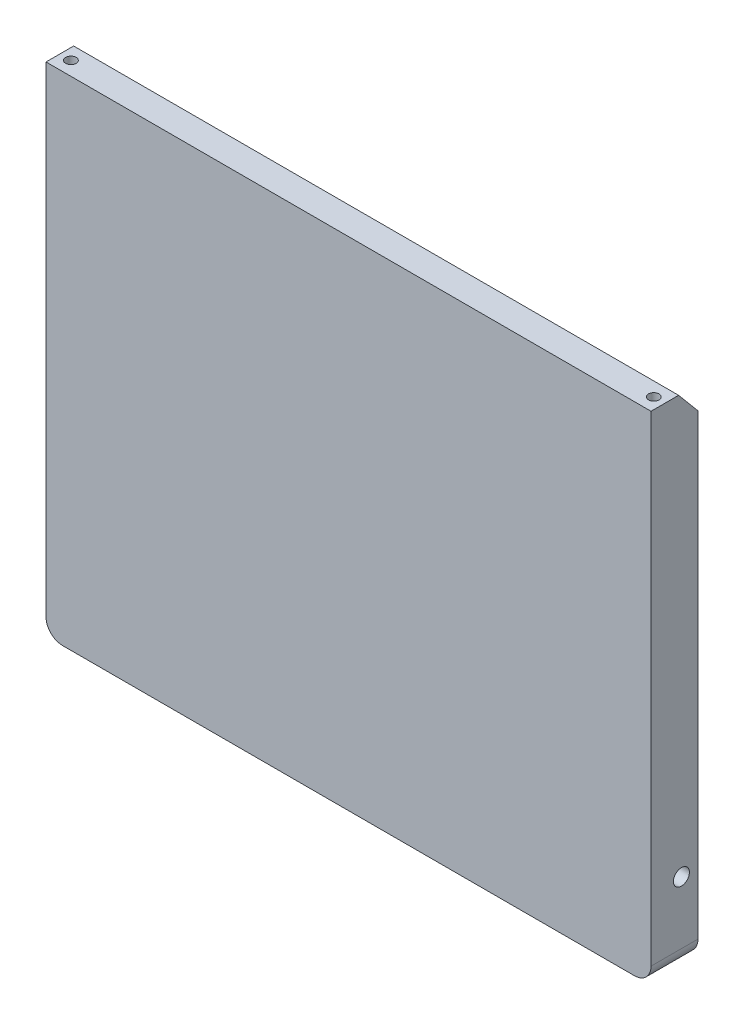
ISO-10303-21;
HEADER;
FILE_DESCRIPTION(('STEP AP214'),'2;1');
FILE_NAME('part.step','',(''),(''),'','','');
FILE_SCHEMA(('AUTOMOTIVE_DESIGN { 1 0 10303 214 1 1 1 1 }'));
ENDSEC;
DATA;
#1=APPLICATION_CONTEXT('core data for automotive mechanical design processes');
#2=APPLICATION_PROTOCOL_DEFINITION('international standard','automotive_design',2000,#1);
#3=PRODUCT_CONTEXT('',#1,'mechanical');
#4=PRODUCT('Part','Part','',(#3));
#5=PRODUCT_RELATED_PRODUCT_CATEGORY('part','',(#4));
#6=PRODUCT_DEFINITION_FORMATION('','',#4);
#7=PRODUCT_DEFINITION_CONTEXT('part definition',#1,'design');
#8=PRODUCT_DEFINITION('design','',#6,#7);
#9=PRODUCT_DEFINITION_SHAPE('','',#8);
#10=(LENGTH_UNIT() NAMED_UNIT(*) SI_UNIT(.MILLI.,.METRE.));
#11=(NAMED_UNIT(*) PLANE_ANGLE_UNIT() SI_UNIT($,.RADIAN.));
#12=(NAMED_UNIT(*) SI_UNIT($,.STERADIAN.) SOLID_ANGLE_UNIT());
#13=UNCERTAINTY_MEASURE_WITH_UNIT(LENGTH_MEASURE(1.E-05),#10,'distance_accuracy_value','');
#14=(GEOMETRIC_REPRESENTATION_CONTEXT(3) GLOBAL_UNCERTAINTY_ASSIGNED_CONTEXT((#13)) GLOBAL_UNIT_ASSIGNED_CONTEXT((#10,
#11,#12)) REPRESENTATION_CONTEXT('',''));
#15=CARTESIAN_POINT('',(0.,0.,0.));
#16=DIRECTION('',(0.,0.,1.));
#17=DIRECTION('',(1.,0.,0.));
#18=AXIS2_PLACEMENT_3D('',#15,#16,#17);
#19=CARTESIAN_POINT('',(-5.30656779661017,-80.8019491525424,5.));
#20=DIRECTION('',(1.,0.,0.));
#21=DIRECTION('',(0.,0.,-1.));
#22=AXIS2_PLACEMENT_3D('',#19,#20,#21);
#23=PLANE('',#22);
#24=CARTESIAN_POINT('',(-5.30656779661018,-66.5519491525424,-0.500000000000002));
#25=DIRECTION('',(1.,0.,0.));
#26=DIRECTION('',(0.,0.,-1.));
#27=AXIS2_PLACEMENT_3D('',#24,#25,#26);
#28=CIRCLE('',#27,1.44999999999999);
#29=CARTESIAN_POINT('',(-5.30656779661018,-66.5519491525424,-1.94999999999999));
#30=VERTEX_POINT('',#29);
#31=EDGE_CURVE('E567',#30,#30,#28,.T.);
#32=ORIENTED_EDGE('',*,*,#31,.T.);
#33=EDGE_LOOP('',(#32));
#34=FACE_BOUND('',#33,.T.);
#35=DIRECTION('',(0.,0.,-1.));
#36=VECTOR('',#35,1.);
#37=CARTESIAN_POINT('',(-5.30656779661017,9.19805084745762,5.));
#38=LINE('',#37,#36);
#39=CARTESIAN_POINT('',(-5.30656779661017,9.19805084745762,5.));
#40=VERTEX_POINT('',#39);
#41=CARTESIAN_POINT('',(-5.30656779661017,9.19805084745762,0.));
#42=VERTEX_POINT('',#41);
#43=EDGE_CURVE('E203',#40,#42,#38,.T.);
#44=ORIENTED_EDGE('',*,*,#43,.T.);
#45=DIRECTION('',(0.,-0.766044443118977,-0.642787609686541));
#46=VECTOR('',#45,1.);
#47=CARTESIAN_POINT('',(-5.30656779661016,5.02691327337787,-3.5));
#48=LINE('',#47,#46);
#49=CARTESIAN_POINT('',(-5.30656779661017,5.02691327337787,-3.5));
#50=VERTEX_POINT('',#49);
#51=EDGE_CURVE('E11',#42,#50,#48,.T.);
#52=ORIENTED_EDGE('',*,*,#51,.T.);
#53=DIRECTION('',(0.,1.,0.));
#54=VECTOR('',#53,1.);
#55=CARTESIAN_POINT('',(-5.30656779661017,-77.8019491525424,-3.5));
#56=LINE('',#55,#54);
#57=CARTESIAN_POINT('',(-5.30656779661017,-77.8019491525424,-3.5));
#58=VERTEX_POINT('',#57);
#59=EDGE_CURVE('E178',#58,#50,#56,.T.);
#60=ORIENTED_EDGE('',*,*,#59,.F.);
#61=DIRECTION('',(0.,0.,-1.));
#62=VECTOR('',#61,1.);
#63=CARTESIAN_POINT('',(-5.30656779661017,-77.8019491525424,5.));
#64=LINE('',#63,#62);
#65=CARTESIAN_POINT('',(-5.30656779661017,-77.8019491525424,5.));
#66=VERTEX_POINT('',#65);
#67=EDGE_CURVE('E218',#58,#66,#64,.F.);
#68=ORIENTED_EDGE('',*,*,#67,.T.);
#69=DIRECTION('',(0.,-1.,0.));
#70=VECTOR('',#69,1.);
#71=CARTESIAN_POINT('',(-5.30656779661017,-80.8019491525424,5.));
#72=LINE('',#71,#70);
#73=EDGE_CURVE('E185',#40,#66,#72,.T.);
#74=ORIENTED_EDGE('',*,*,#73,.F.);
#75=EDGE_LOOP('',(#44,#52,#60,#68,#74));
#76=FACE_BOUND('',#75,.T.);
#77=ADVANCED_FACE('F41',(#34,#76),#23,.F.);
#78=CARTESIAN_POINT('',(-5.30656779661017,-80.8019491525424,5.));
#79=DIRECTION('',(0.,1.,0.));
#80=DIRECTION('',(0.,0.,1.));
#81=AXIS2_PLACEMENT_3D('',#78,#79,#80);
#82=PLANE('',#81);
#83=DIRECTION('',(0.,0.,-1.));
#84=VECTOR('',#83,1.);
#85=CARTESIAN_POINT('',(-2.30656779661017,-80.8019491525424,5.));
#86=LINE('',#85,#84);
#87=CARTESIAN_POINT('',(-2.30656779661017,-80.8019491525424,5.));
#88=VERTEX_POINT('',#87);
#89=CARTESIAN_POINT('',(-2.30656779661017,-80.8019491525424,-3.5));
#90=VERTEX_POINT('',#89);
#91=EDGE_CURVE('E210',#88,#90,#86,.T.);
#92=ORIENTED_EDGE('',*,*,#91,.T.);
#93=DIRECTION('',(-1.,0.,0.));
#94=VECTOR('',#93,1.);
#95=CARTESIAN_POINT('',(101.21343220339,-80.8019491525424,-3.5));
#96=LINE('',#95,#94);
#97=CARTESIAN_POINT('',(101.21343220339,-80.8019491525424,-3.5));
#98=VERTEX_POINT('',#97);
#99=EDGE_CURVE('E172',#98,#90,#96,.T.);
#100=ORIENTED_EDGE('',*,*,#99,.F.);
#101=DIRECTION('',(0.,0.,-1.));
#102=VECTOR('',#101,1.);
#103=CARTESIAN_POINT('',(101.21343220339,-80.8019491525424,5.));
#104=LINE('',#103,#102);
#105=CARTESIAN_POINT('',(101.21343220339,-80.8019491525424,5.));
#106=VERTEX_POINT('',#105);
#107=EDGE_CURVE('E212',#98,#106,#104,.F.);
#108=ORIENTED_EDGE('',*,*,#107,.T.);
#109=DIRECTION('',(1.,0.,0.));
#110=VECTOR('',#109,1.);
#111=CARTESIAN_POINT('',(-5.30656779661017,-80.8019491525424,5.));
#112=LINE('',#111,#110);
#113=EDGE_CURVE('E196',#88,#106,#112,.T.);
#114=ORIENTED_EDGE('',*,*,#113,.F.);
#115=EDGE_LOOP('',(#92,#100,#108,#114));
#116=FACE_BOUND('',#115,.T.);
#117=ADVANCED_FACE('F254',(#116),#82,.F.);
#118=CARTESIAN_POINT('',(104.21343220339,-80.8019491525424,5.));
#119=DIRECTION('',(-1.,0.,0.));
#120=DIRECTION('',(0.,0.,1.));
#121=AXIS2_PLACEMENT_3D('',#118,#119,#120);
#122=PLANE('',#121);
#123=CARTESIAN_POINT('',(104.21343220339,-66.5519491525424,-0.500000000000002));
#124=DIRECTION('',(1.,0.,0.));
#125=DIRECTION('',(0.,0.,-1.));
#126=AXIS2_PLACEMENT_3D('',#123,#124,#125);
#127=CIRCLE('',#126,1.44999999999999);
#128=CARTESIAN_POINT('',(104.21343220339,-66.5519491525424,-1.94999999999999));
#129=VERTEX_POINT('',#128);
#130=EDGE_CURVE('E151',#129,#129,#127,.T.);
#131=ORIENTED_EDGE('',*,*,#130,.F.);
#132=EDGE_LOOP('',(#131));
#133=FACE_BOUND('',#132,.T.);
#134=DIRECTION('',(0.,-1.,0.));
#135=VECTOR('',#134,1.);
#136=CARTESIAN_POINT('',(104.21343220339,9.19805084745762,-3.5));
#137=LINE('',#136,#135);
#138=CARTESIAN_POINT('',(104.21343220339,5.02691327337787,-3.5));
#139=VERTEX_POINT('',#138);
#140=CARTESIAN_POINT('',(104.21343220339,-77.8019491525424,-3.5));
#141=VERTEX_POINT('',#140);
#142=EDGE_CURVE('E164',#139,#141,#137,.T.);
#143=ORIENTED_EDGE('',*,*,#142,.F.);
#144=DIRECTION('',(0.,0.766044443118977,0.642787609686541));
#145=VECTOR('',#144,1.);
#146=CARTESIAN_POINT('',(104.21343220339,5.02691327337787,-3.5));
#147=LINE('',#146,#145);
#148=CARTESIAN_POINT('',(104.21343220339,9.19805084745762,0.));
#149=VERTEX_POINT('',#148);
#150=EDGE_CURVE('E223',#139,#149,#147,.T.);
#151=ORIENTED_EDGE('',*,*,#150,.T.);
#152=DIRECTION('',(0.,0.,-1.));
#153=VECTOR('',#152,1.);
#154=CARTESIAN_POINT('',(104.21343220339,9.19805084745762,5.));
#155=LINE('',#154,#153);
#156=CARTESIAN_POINT('',(104.21343220339,9.19805084745762,5.));
#157=VERTEX_POINT('',#156);
#158=EDGE_CURVE('E205',#157,#149,#155,.T.);
#159=ORIENTED_EDGE('',*,*,#158,.F.);
#160=DIRECTION('',(0.,1.,0.));
#161=VECTOR('',#160,1.);
#162=CARTESIAN_POINT('',(104.21343220339,-80.8019491525424,5.));
#163=LINE('',#162,#161);
#164=CARTESIAN_POINT('',(104.21343220339,-77.8019491525424,5.));
#165=VERTEX_POINT('',#164);
#166=EDGE_CURVE('E199',#165,#157,#163,.T.);
#167=ORIENTED_EDGE('',*,*,#166,.F.);
#168=DIRECTION('',(0.,0.,-1.));
#169=VECTOR('',#168,1.);
#170=CARTESIAN_POINT('',(104.21343220339,-77.8019491525424,5.));
#171=LINE('',#170,#169);
#172=EDGE_CURVE('E207',#165,#141,#171,.T.);
#173=ORIENTED_EDGE('',*,*,#172,.T.);
#174=EDGE_LOOP('',(#143,#151,#159,#167,#173));
#175=FACE_BOUND('',#174,.T.);
#176=ADVANCED_FACE('F227',(#133,#175),#122,.F.);
#177=CARTESIAN_POINT('',(-5.30656779661017,9.19805084745762,5.));
#178=DIRECTION('',(0.,-1.,0.));
#179=DIRECTION('',(0.,0.,-1.));
#180=AXIS2_PLACEMENT_3D('',#177,#178,#179);
#181=PLANE('',#180);
#182=CARTESIAN_POINT('',(102.21343220339,9.19805084745762,2.5));
#183=DIRECTION('',(0.,1.,0.));
#184=DIRECTION('',(0.,0.,1.));
#185=AXIS2_PLACEMENT_3D('',#182,#183,#184);
#186=CIRCLE('',#185,0.950000000000002);
#187=CARTESIAN_POINT('',(102.21343220339,9.19805084745762,3.45));
#188=VERTEX_POINT('',#187);
#189=EDGE_CURVE('E186',#188,#188,#186,.T.);
#190=ORIENTED_EDGE('',*,*,#189,.F.);
#191=EDGE_LOOP('',(#190));
#192=FACE_BOUND('',#191,.T.);
#193=CARTESIAN_POINT('',(-3.30656779661017,9.19805084745762,2.5));
#194=DIRECTION('',(0.,1.,0.));
#195=DIRECTION('',(0.,0.,1.));
#196=AXIS2_PLACEMENT_3D('',#193,#194,#195);
#197=CIRCLE('',#196,0.95);
#198=CARTESIAN_POINT('',(-3.30656779661017,9.19805084745762,3.45));
#199=VERTEX_POINT('',#198);
#200=EDGE_CURVE('E189',#199,#199,#197,.T.);
#201=ORIENTED_EDGE('',*,*,#200,.F.);
#202=EDGE_LOOP('',(#201));
#203=FACE_BOUND('',#202,.T.);
#204=ORIENTED_EDGE('',*,*,#158,.T.);
#205=DIRECTION('',(-1.,0.,0.));
#206=VECTOR('',#205,1.);
#207=CARTESIAN_POINT('',(-5.30656779661017,9.19805084745762,0.));
#208=LINE('',#207,#206);
#209=EDGE_CURVE('E50',#149,#42,#208,.T.);
#210=ORIENTED_EDGE('',*,*,#209,.T.);
#211=ORIENTED_EDGE('',*,*,#43,.F.);
#212=DIRECTION('',(-1.,0.,0.));
#213=VECTOR('',#212,1.);
#214=CARTESIAN_POINT('',(-5.30656779661017,9.19805084745762,5.));
#215=LINE('',#214,#213);
#216=EDGE_CURVE('E201',#157,#40,#215,.T.);
#217=ORIENTED_EDGE('',*,*,#216,.F.);
#218=EDGE_LOOP('',(#204,#210,#211,#217));
#219=FACE_BOUND('',#218,.T.);
#220=ADVANCED_FACE('F232',(#192,#203,#219),#181,.F.);
#221=CARTESIAN_POINT('',(0.,0.,5.));
#222=DIRECTION('',(0.,0.,-1.));
#223=DIRECTION('',(-1.,0.,0.));
#224=AXIS2_PLACEMENT_3D('',#221,#222,#223);
#225=PLANE('',#224);
#226=ORIENTED_EDGE('',*,*,#113,.T.);
#227=CARTESIAN_POINT('',(101.21343220339,-77.8019491525424,5.));
#228=DIRECTION('',(0.,0.,-1.));
#229=DIRECTION('',(-1.,0.,0.));
#230=AXIS2_PLACEMENT_3D('',#227,#228,#229);
#231=CIRCLE('',#230,3.);
#232=EDGE_CURVE('E216',#106,#165,#231,.F.);
#233=ORIENTED_EDGE('',*,*,#232,.T.);
#234=ORIENTED_EDGE('',*,*,#166,.T.);
#235=ORIENTED_EDGE('',*,*,#216,.T.);
#236=ORIENTED_EDGE('',*,*,#73,.T.);
#237=CARTESIAN_POINT('',(-2.30656779661017,-77.8019491525424,5.));
#238=DIRECTION('',(0.,0.,-1.));
#239=DIRECTION('',(-1.,0.,0.));
#240=AXIS2_PLACEMENT_3D('',#237,#238,#239);
#241=CIRCLE('',#240,3.);
#242=EDGE_CURVE('E214',#66,#88,#241,.F.);
#243=ORIENTED_EDGE('',*,*,#242,.T.);
#244=EDGE_LOOP('',(#226,#233,#234,#235,#236,#243));
#245=FACE_BOUND('',#244,.T.);
#246=ADVANCED_FACE('F246',(#245),#225,.F.);
#247=CARTESIAN_POINT('',(-3.30656779661017,2.19805084745762,2.5));
#248=DIRECTION('',(0.,1.,0.));
#249=DIRECTION('',(0.,0.,1.));
#250=AXIS2_PLACEMENT_3D('',#247,#248,#249);
#251=CYLINDRICAL_SURFACE('',#250,0.95);
#252=CARTESIAN_POINT('',(-3.30656779661017,2.19805084745762,2.5));
#253=DIRECTION('',(0.,1.,0.));
#254=DIRECTION('',(0.,0.,1.));
#255=AXIS2_PLACEMENT_3D('',#252,#253,#254);
#256=CIRCLE('',#255,0.95);
#257=CARTESIAN_POINT('',(-3.30656779661017,2.19805084745762,3.45));
#258=VERTEX_POINT('',#257);
#259=EDGE_CURVE('E181',#258,#258,#256,.T.);
#260=ORIENTED_EDGE('',*,*,#259,.F.);
#261=EDGE_LOOP('',(#260));
#262=FACE_BOUND('',#261,.T.);
#263=ORIENTED_EDGE('',*,*,#200,.T.);
#264=EDGE_LOOP('',(#263));
#265=FACE_BOUND('',#264,.T.);
#266=ADVANCED_FACE('F289',(#262,#265),#251,.F.);
#267=CARTESIAN_POINT('',(-3.30656779661017,2.19805084745762,2.5));
#268=DIRECTION('',(0.,1.,0.));
#269=DIRECTION('',(0.,0.,1.));
#270=AXIS2_PLACEMENT_3D('',#267,#268,#269);
#271=PLANE('',#270);
#272=ORIENTED_EDGE('',*,*,#259,.T.);
#273=EDGE_LOOP('',(#272));
#274=FACE_BOUND('',#273,.T.);
#275=ADVANCED_FACE('F287',(#274),#271,.T.);
#276=CARTESIAN_POINT('',(102.21343220339,2.19805084745762,2.5));
#277=DIRECTION('',(0.,1.,0.));
#278=DIRECTION('',(0.,0.,1.));
#279=AXIS2_PLACEMENT_3D('',#276,#277,#278);
#280=CYLINDRICAL_SURFACE('',#279,0.950000000000002);
#281=CARTESIAN_POINT('',(102.21343220339,2.19805084745762,2.5));
#282=DIRECTION('',(0.,1.,0.));
#283=DIRECTION('',(0.,0.,1.));
#284=AXIS2_PLACEMENT_3D('',#281,#282,#283);
#285=CIRCLE('',#284,0.950000000000002);
#286=CARTESIAN_POINT('',(102.21343220339,2.19805084745762,3.45));
#287=VERTEX_POINT('',#286);
#288=EDGE_CURVE('E182',#287,#287,#285,.T.);
#289=ORIENTED_EDGE('',*,*,#288,.F.);
#290=EDGE_LOOP('',(#289));
#291=FACE_BOUND('',#290,.T.);
#292=ORIENTED_EDGE('',*,*,#189,.T.);
#293=EDGE_LOOP('',(#292));
#294=FACE_BOUND('',#293,.T.);
#295=ADVANCED_FACE('F283',(#291,#294),#280,.F.);
#296=CARTESIAN_POINT('',(102.21343220339,2.19805084745762,2.5));
#297=DIRECTION('',(0.,1.,0.));
#298=DIRECTION('',(0.,0.,1.));
#299=AXIS2_PLACEMENT_3D('',#296,#297,#298);
#300=PLANE('',#299);
#301=ORIENTED_EDGE('',*,*,#288,.T.);
#302=EDGE_LOOP('',(#301));
#303=FACE_BOUND('',#302,.T.);
#304=ADVANCED_FACE('F268',(#303),#300,.T.);
#305=CARTESIAN_POINT('',(101.21343220339,-77.8019491525424,5.));
#306=DIRECTION('',(0.,0.,-1.));
#307=DIRECTION('',(-1.,0.,0.));
#308=AXIS2_PLACEMENT_3D('',#305,#306,#307);
#309=CYLINDRICAL_SURFACE('',#308,3.);
#310=ORIENTED_EDGE('',*,*,#232,.F.);
#311=ORIENTED_EDGE('',*,*,#107,.F.);
#312=CARTESIAN_POINT('',(101.21343220339,-77.8019491525424,-3.5));
#313=DIRECTION('',(0.,0.,-1.));
#314=DIRECTION('',(-1.,0.,0.));
#315=AXIS2_PLACEMENT_3D('',#312,#313,#314);
#316=CIRCLE('',#315,3.);
#317=EDGE_CURVE('E169',#141,#98,#316,.T.);
#318=ORIENTED_EDGE('',*,*,#317,.F.);
#319=ORIENTED_EDGE('',*,*,#172,.F.);
#320=EDGE_LOOP('',(#310,#311,#318,#319));
#321=FACE_BOUND('',#320,.T.);
#322=ADVANCED_FACE('F252',(#321),#309,.T.);
#323=CARTESIAN_POINT('',(-2.30656779661017,-77.8019491525424,5.));
#324=DIRECTION('',(0.,0.,-1.));
#325=DIRECTION('',(-1.,0.,0.));
#326=AXIS2_PLACEMENT_3D('',#323,#324,#325);
#327=CYLINDRICAL_SURFACE('',#326,3.);
#328=ORIENTED_EDGE('',*,*,#242,.F.);
#329=ORIENTED_EDGE('',*,*,#67,.F.);
#330=CARTESIAN_POINT('',(-2.30656779661017,-77.8019491525424,-3.5));
#331=DIRECTION('',(0.,0.,-1.));
#332=DIRECTION('',(-1.,0.,0.));
#333=AXIS2_PLACEMENT_3D('',#330,#331,#332);
#334=CIRCLE('',#333,3.);
#335=EDGE_CURVE('E175',#90,#58,#334,.T.);
#336=ORIENTED_EDGE('',*,*,#335,.F.);
#337=ORIENTED_EDGE('',*,*,#91,.F.);
#338=EDGE_LOOP('',(#328,#329,#336,#337));
#339=FACE_BOUND('',#338,.T.);
#340=ADVANCED_FACE('F244',(#339),#327,.T.);
#341=CARTESIAN_POINT('',(101.21343220339,-77.8019491525424,-3.5));
#342=DIRECTION('',(0.,0.,-1.));
#343=DIRECTION('',(-1.,0.,0.));
#344=AXIS2_PLACEMENT_3D('',#341,#342,#343);
#345=PLANE('',#344);
#346=DIRECTION('',(0.,-1.,0.));
#347=VECTOR('',#346,1.);
#348=CARTESIAN_POINT('',(99.5534322033898,3.79805084745763,-3.5));
#349=LINE('',#348,#347);
#350=CARTESIAN_POINT('',(99.5534322033898,3.79805084745763,-3.5));
#351=VERTEX_POINT('',#350);
#352=CARTESIAN_POINT('',(99.5534322033898,-75.4019491525424,-3.5));
#353=VERTEX_POINT('',#352);
#354=EDGE_CURVE('E57',#351,#353,#349,.T.);
#355=ORIENTED_EDGE('',*,*,#354,.F.);
#356=DIRECTION('',(1.,0.,0.));
#357=VECTOR('',#356,1.);
#358=CARTESIAN_POINT('',(99.5534322033898,3.79805084745763,-3.5));
#359=LINE('',#358,#357);
#360=CARTESIAN_POINT('',(-0.646567796610172,3.79805084745764,-3.5));
#361=VERTEX_POINT('',#360);
#362=EDGE_CURVE('E145',#361,#351,#359,.T.);
#363=ORIENTED_EDGE('',*,*,#362,.F.);
#364=DIRECTION('',(0.,1.,0.));
#365=VECTOR('',#364,1.);
#366=CARTESIAN_POINT('',(-0.646567796610172,3.79805084745764,-3.5));
#367=LINE('',#366,#365);
#368=CARTESIAN_POINT('',(-0.646567796610172,-75.4019491525424,-3.5));
#369=VERTEX_POINT('',#368);
#370=EDGE_CURVE('E148',#369,#361,#367,.T.);
#371=ORIENTED_EDGE('',*,*,#370,.F.);
#372=DIRECTION('',(-1.,0.,0.));
#373=VECTOR('',#372,1.);
#374=CARTESIAN_POINT('',(99.5534322033898,-75.4019491525424,-3.5));
#375=LINE('',#374,#373);
#376=EDGE_CURVE('E157',#353,#369,#375,.T.);
#377=ORIENTED_EDGE('',*,*,#376,.F.);
#378=EDGE_LOOP('',(#355,#363,#371,#377));
#379=FACE_BOUND('',#378,.T.);
#380=ORIENTED_EDGE('',*,*,#59,.T.);
#381=DIRECTION('',(1.,0.,0.));
#382=VECTOR('',#381,1.);
#383=CARTESIAN_POINT('',(104.21343220339,5.02691327337787,-3.5));
#384=LINE('',#383,#382);
#385=EDGE_CURVE('E220',#50,#139,#384,.T.);
#386=ORIENTED_EDGE('',*,*,#385,.T.);
#387=ORIENTED_EDGE('',*,*,#142,.T.);
#388=ORIENTED_EDGE('',*,*,#317,.T.);
#389=ORIENTED_EDGE('',*,*,#99,.T.);
#390=ORIENTED_EDGE('',*,*,#335,.T.);
#391=EDGE_LOOP('',(#380,#386,#387,#388,#389,#390));
#392=FACE_BOUND('',#391,.T.);
#393=ADVANCED_FACE('F238',(#379,#392),#345,.T.);
#394=CARTESIAN_POINT('',(101.21343220339,5.02691327337787,-3.5));
#395=DIRECTION('',(0.,0.642787609686541,-0.766044443118977));
#396=DIRECTION('',(-1.,0.,0.));
#397=AXIS2_PLACEMENT_3D('',#394,#395,#396);
#398=PLANE('',#397);
#399=ORIENTED_EDGE('',*,*,#51,.F.);
#400=ORIENTED_EDGE('',*,*,#209,.F.);
#401=ORIENTED_EDGE('',*,*,#150,.F.);
#402=ORIENTED_EDGE('',*,*,#385,.F.);
#403=EDGE_LOOP('',(#399,#400,#401,#402));
#404=FACE_BOUND('',#403,.T.);
#405=ADVANCED_FACE('F44',(#404),#398,.T.);
#406=CARTESIAN_POINT('',(99.5534322033898,3.79805084745763,3.));
#407=DIRECTION('',(1.,0.,0.));
#408=DIRECTION('',(0.,0.,-1.));
#409=AXIS2_PLACEMENT_3D('',#406,#407,#408);
#410=PLANE('',#409);
#411=ORIENTED_EDGE('',*,*,#354,.T.);
#412=DIRECTION('',(0.,0.,-1.));
#413=VECTOR('',#412,1.);
#414=CARTESIAN_POINT('',(99.5534322033898,-75.4019491525424,3.));
#415=LINE('',#414,#413);
#416=CARTESIAN_POINT('',(99.5534322033898,-75.4019491525424,3.));
#417=VERTEX_POINT('',#416);
#418=EDGE_CURVE('E123',#417,#353,#415,.T.);
#419=ORIENTED_EDGE('',*,*,#418,.F.);
#420=DIRECTION('',(0.,-1.,0.));
#421=VECTOR('',#420,1.);
#422=CARTESIAN_POINT('',(99.5534322033898,3.79805084745763,3.));
#423=LINE('',#422,#421);
#424=CARTESIAN_POINT('',(99.5534322033898,3.79805084745763,3.));
#425=VERTEX_POINT('',#424);
#426=EDGE_CURVE('E127',#425,#417,#423,.T.);
#427=ORIENTED_EDGE('',*,*,#426,.F.);
#428=DIRECTION('',(0.,0.,-1.));
#429=VECTOR('',#428,1.);
#430=CARTESIAN_POINT('',(99.5534322033898,3.79805084745763,3.));
#431=LINE('',#430,#429);
#432=EDGE_CURVE('E162',#425,#351,#431,.T.);
#433=ORIENTED_EDGE('',*,*,#432,.T.);
#434=EDGE_LOOP('',(#411,#419,#427,#433));
#435=FACE_BOUND('',#434,.T.);
#436=ADVANCED_FACE('F125',(#435),#410,.F.);
#437=CARTESIAN_POINT('',(99.5534322033898,3.79805084745763,3.));
#438=DIRECTION('',(0.,1.,0.));
#439=DIRECTION('',(-1.,0.,0.));
#440=AXIS2_PLACEMENT_3D('',#437,#438,#439);
#441=PLANE('',#440);
#442=ORIENTED_EDGE('',*,*,#362,.T.);
#443=ORIENTED_EDGE('',*,*,#432,.F.);
#444=DIRECTION('',(1.,0.,0.));
#445=VECTOR('',#444,1.);
#446=CARTESIAN_POINT('',(99.5534322033898,3.79805084745763,3.));
#447=LINE('',#446,#445);
#448=CARTESIAN_POINT('',(-0.646567796610172,3.79805084745764,3.));
#449=VERTEX_POINT('',#448);
#450=EDGE_CURVE('E133',#449,#425,#447,.T.);
#451=ORIENTED_EDGE('',*,*,#450,.F.);
#452=DIRECTION('',(0.,0.,-1.));
#453=VECTOR('',#452,1.);
#454=CARTESIAN_POINT('',(-0.646567796610172,3.79805084745764,3.));
#455=LINE('',#454,#453);
#456=EDGE_CURVE('E165',#449,#361,#455,.T.);
#457=ORIENTED_EDGE('',*,*,#456,.T.);
#458=EDGE_LOOP('',(#442,#443,#451,#457));
#459=FACE_BOUND('',#458,.T.);
#460=ADVANCED_FACE('F356',(#459),#441,.F.);
#461=CARTESIAN_POINT('',(-0.646567796610172,3.79805084745764,3.));
#462=DIRECTION('',(-1.,0.,0.));
#463=DIRECTION('',(0.,0.,1.));
#464=AXIS2_PLACEMENT_3D('',#461,#462,#463);
#465=PLANE('',#464);
#466=ORIENTED_EDGE('',*,*,#370,.T.);
#467=ORIENTED_EDGE('',*,*,#456,.F.);
#468=DIRECTION('',(0.,1.,0.));
#469=VECTOR('',#468,1.);
#470=CARTESIAN_POINT('',(-0.646567796610172,3.79805084745764,3.));
#471=LINE('',#470,#469);
#472=CARTESIAN_POINT('',(-0.646567796610172,-75.4019491525424,3.));
#473=VERTEX_POINT('',#472);
#474=EDGE_CURVE('E141',#473,#449,#471,.T.);
#475=ORIENTED_EDGE('',*,*,#474,.F.);
#476=DIRECTION('',(0.,0.,-1.));
#477=VECTOR('',#476,1.);
#478=CARTESIAN_POINT('',(-0.646567796610172,-75.4019491525424,3.));
#479=LINE('',#478,#477);
#480=EDGE_CURVE('E132',#473,#369,#479,.T.);
#481=ORIENTED_EDGE('',*,*,#480,.T.);
#482=EDGE_LOOP('',(#466,#467,#475,#481));
#483=FACE_BOUND('',#482,.T.);
#484=ADVANCED_FACE('F364',(#483),#465,.F.);
#485=CARTESIAN_POINT('',(99.5534322033898,-75.4019491525424,3.));
#486=DIRECTION('',(0.,-1.,0.));
#487=DIRECTION('',(1.,0.,0.));
#488=AXIS2_PLACEMENT_3D('',#485,#486,#487);
#489=PLANE('',#488);
#490=ORIENTED_EDGE('',*,*,#376,.T.);
#491=ORIENTED_EDGE('',*,*,#480,.F.);
#492=DIRECTION('',(-1.,0.,0.));
#493=VECTOR('',#492,1.);
#494=CARTESIAN_POINT('',(99.5534322033898,-75.4019491525424,3.));
#495=LINE('',#494,#493);
#496=EDGE_CURVE('E136',#417,#473,#495,.T.);
#497=ORIENTED_EDGE('',*,*,#496,.F.);
#498=ORIENTED_EDGE('',*,*,#418,.T.);
#499=EDGE_LOOP('',(#490,#491,#497,#498));
#500=FACE_BOUND('',#499,.T.);
#501=ADVANCED_FACE('F137',(#500),#489,.F.);
#502=CARTESIAN_POINT('',(0.,0.,3.));
#503=DIRECTION('',(0.,0.,-1.));
#504=DIRECTION('',(-1.,0.,0.));
#505=AXIS2_PLACEMENT_3D('',#502,#503,#504);
#506=PLANE('',#505);
#507=ORIENTED_EDGE('',*,*,#426,.T.);
#508=ORIENTED_EDGE('',*,*,#496,.T.);
#509=ORIENTED_EDGE('',*,*,#474,.T.);
#510=ORIENTED_EDGE('',*,*,#450,.T.);
#511=EDGE_LOOP('',(#507,#508,#509,#510));
#512=FACE_BOUND('',#511,.T.);
#513=ADVANCED_FACE('F143',(#512),#506,.T.);
#514=CARTESIAN_POINT('',(101.21343220339,-66.5519491525424,-0.500000000000002));
#515=DIRECTION('',(1.,0.,0.));
#516=DIRECTION('',(0.,0.,-1.));
#517=AXIS2_PLACEMENT_3D('',#514,#515,#516);
#518=CYLINDRICAL_SURFACE('',#517,1.44999999999999);
#519=CARTESIAN_POINT('',(101.21343220339,-66.5519491525424,-0.500000000000002));
#520=DIRECTION('',(1.,0.,0.));
#521=DIRECTION('',(0.,0.,-1.));
#522=AXIS2_PLACEMENT_3D('',#519,#520,#521);
#523=CIRCLE('',#522,1.44999999999999);
#524=CARTESIAN_POINT('',(101.21343220339,-66.5519491525424,-1.94999999999999));
#525=VERTEX_POINT('',#524);
#526=EDGE_CURVE('E158',#525,#525,#523,.T.);
#527=ORIENTED_EDGE('',*,*,#526,.F.);
#528=EDGE_LOOP('',(#527));
#529=FACE_BOUND('',#528,.T.);
#530=ORIENTED_EDGE('',*,*,#130,.T.);
#531=EDGE_LOOP('',(#530));
#532=FACE_BOUND('',#531,.T.);
#533=ADVANCED_FACE('F390',(#529,#532),#518,.F.);
#534=CARTESIAN_POINT('',(101.21343220339,-66.5519491525424,-0.500000000000002));
#535=DIRECTION('',(1.,0.,0.));
#536=DIRECTION('',(0.,0.,-1.));
#537=AXIS2_PLACEMENT_3D('',#534,#535,#536);
#538=PLANE('',#537);
#539=ORIENTED_EDGE('',*,*,#526,.T.);
#540=EDGE_LOOP('',(#539));
#541=FACE_BOUND('',#540,.T.);
#542=ADVANCED_FACE('F400',(#541),#538,.T.);
#543=CARTESIAN_POINT('',(-2.30656779661018,-66.5519491525424,-0.500000000000002));
#544=DIRECTION('',(-1.,0.,0.));
#545=DIRECTION('',(0.,0.,1.));
#546=AXIS2_PLACEMENT_3D('',#543,#544,#545);
#547=CYLINDRICAL_SURFACE('',#546,1.44999999999999);
#548=CARTESIAN_POINT('',(-2.30656779661018,-66.5519491525424,-0.500000000000002));
#549=DIRECTION('',(1.,0.,0.));
#550=DIRECTION('',(0.,0.,-1.));
#551=AXIS2_PLACEMENT_3D('',#548,#549,#550);
#552=CIRCLE('',#551,1.44999999999999);
#553=CARTESIAN_POINT('',(-2.30656779661018,-66.5519491525424,-1.94999999999999));
#554=VERTEX_POINT('',#553);
#555=EDGE_CURVE('E566',#554,#554,#552,.T.);
#556=ORIENTED_EDGE('',*,*,#555,.T.);
#557=EDGE_LOOP('',(#556));
#558=FACE_BOUND('',#557,.T.);
#559=ORIENTED_EDGE('',*,*,#31,.F.);
#560=EDGE_LOOP('',(#559));
#561=FACE_BOUND('',#560,.T.);
#562=ADVANCED_FACE('F410',(#558,#561),#547,.F.);
#563=CARTESIAN_POINT('',(-2.30656779661018,-66.5519491525424,-0.500000000000002));
#564=DIRECTION('',(-1.,0.,0.));
#565=DIRECTION('',(0.,0.,-1.));
#566=AXIS2_PLACEMENT_3D('',#563,#564,#565);
#567=PLANE('',#566);
#568=ORIENTED_EDGE('',*,*,#555,.F.);
#569=EDGE_LOOP('',(#568));
#570=FACE_BOUND('',#569,.T.);
#571=ADVANCED_FACE('F421',(#570),#567,.T.);
#572=CLOSED_SHELL('',(#77,#117,#176,#220,#246,#266,#275,#295,#304,#322,#340,#393,#405,#436,#460,
#484,#501,#513,#533,#542,#562,#571));
#573=MANIFOLD_SOLID_BREP('B2',#572);
#574=ADVANCED_BREP_SHAPE_REPRESENTATION('',(#18,#573),#14);
#575=SHAPE_DEFINITION_REPRESENTATION(#9,#574);
ENDSEC;
END-ISO-10303-21;
